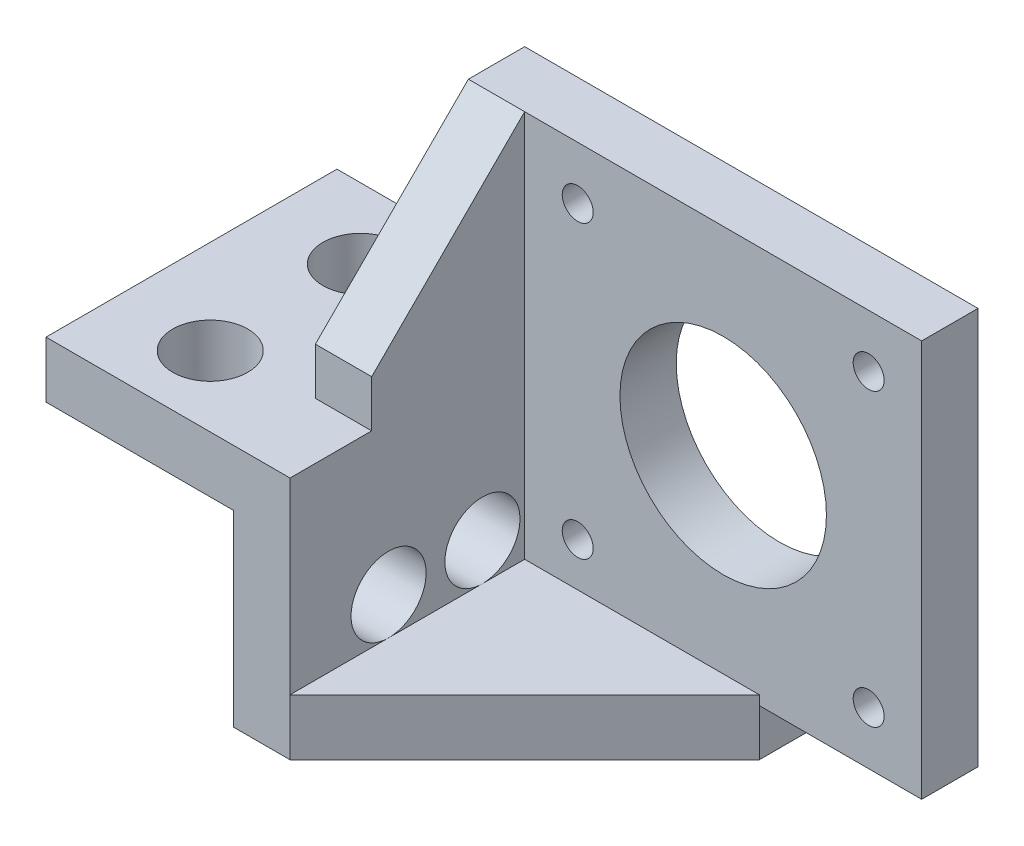
ISO-10303-21;
HEADER;
FILE_DESCRIPTION(('STEP AP214'),'2;1');
FILE_NAME('part.step','',(''),(''),'','','');
FILE_SCHEMA(('AUTOMOTIVE_DESIGN { 1 0 10303 214 1 1 1 1 }'));
ENDSEC;
DATA;
#1=APPLICATION_CONTEXT('core data for automotive mechanical design processes');
#2=APPLICATION_PROTOCOL_DEFINITION('international standard','automotive_design',2000,#1);
#3=PRODUCT_CONTEXT('',#1,'mechanical');
#4=PRODUCT('Part','Part','',(#3));
#5=PRODUCT_RELATED_PRODUCT_CATEGORY('part','',(#4));
#6=PRODUCT_DEFINITION_FORMATION('','',#4);
#7=PRODUCT_DEFINITION_CONTEXT('part definition',#1,'design');
#8=PRODUCT_DEFINITION('design','',#6,#7);
#9=PRODUCT_DEFINITION_SHAPE('','',#8);
#10=(LENGTH_UNIT() NAMED_UNIT(*) SI_UNIT(.MILLI.,.METRE.));
#11=(NAMED_UNIT(*) PLANE_ANGLE_UNIT() SI_UNIT($,.RADIAN.));
#12=(NAMED_UNIT(*) SI_UNIT($,.STERADIAN.) SOLID_ANGLE_UNIT());
#13=UNCERTAINTY_MEASURE_WITH_UNIT(LENGTH_MEASURE(1.E-05),#10,'distance_accuracy_value','');
#14=(GEOMETRIC_REPRESENTATION_CONTEXT(3) GLOBAL_UNCERTAINTY_ASSIGNED_CONTEXT((#13)) GLOBAL_UNIT_ASSIGNED_CONTEXT((#10,
#11,#12)) REPRESENTATION_CONTEXT('',''));
#15=CARTESIAN_POINT('',(0.,0.,0.));
#16=DIRECTION('',(0.,0.,1.));
#17=DIRECTION('',(1.,0.,0.));
#18=AXIS2_PLACEMENT_3D('',#15,#16,#17);
#19=CARTESIAN_POINT('',(0.,0.,6.));
#20=DIRECTION('',(0.,0.,-1.));
#21=DIRECTION('',(-1.,0.,0.));
#22=AXIS2_PLACEMENT_3D('',#19,#20,#21);
#23=PLANE('',#22);
#24=CARTESIAN_POINT('',(47.15,26.15,6.));
#25=DIRECTION('',(0.,0.,-1.));
#26=DIRECTION('',(-1.,0.,0.));
#27=AXIS2_PLACEMENT_3D('',#24,#25,#26);
#28=CIRCLE('',#27,11.);
#29=CARTESIAN_POINT('',(36.15,26.15,6.));
#30=VERTEX_POINT('',#29);
#31=EDGE_CURVE('E291',#30,#30,#28,.T.);
#32=ORIENTED_EDGE('',*,*,#31,.T.);
#33=EDGE_LOOP('',(#32));
#34=FACE_BOUND('',#33,.T.);
#35=CARTESIAN_POINT('',(31.65,10.65,6.));
#36=DIRECTION('',(0.,0.,-1.));
#37=DIRECTION('',(-1.,0.,0.));
#38=AXIS2_PLACEMENT_3D('',#35,#36,#37);
#39=CIRCLE('',#38,1.65);
#40=CARTESIAN_POINT('',(30.,10.65,6.));
#41=VERTEX_POINT('',#40);
#42=EDGE_CURVE('E287',#41,#41,#39,.T.);
#43=ORIENTED_EDGE('',*,*,#42,.T.);
#44=EDGE_LOOP('',(#43));
#45=FACE_BOUND('',#44,.T.);
#46=CARTESIAN_POINT('',(62.65,10.65,6.));
#47=DIRECTION('',(0.,0.,-1.));
#48=DIRECTION('',(-1.,0.,0.));
#49=AXIS2_PLACEMENT_3D('',#46,#47,#48);
#50=CIRCLE('',#49,1.65);
#51=CARTESIAN_POINT('',(61.,10.65,6.));
#52=VERTEX_POINT('',#51);
#53=EDGE_CURVE('E283',#52,#52,#50,.T.);
#54=ORIENTED_EDGE('',*,*,#53,.T.);
#55=EDGE_LOOP('',(#54));
#56=FACE_BOUND('',#55,.T.);
#57=CARTESIAN_POINT('',(62.65,41.65,6.));
#58=DIRECTION('',(0.,0.,-1.));
#59=DIRECTION('',(-1.,0.,0.));
#60=AXIS2_PLACEMENT_3D('',#57,#58,#59);
#61=CIRCLE('',#60,1.65);
#62=CARTESIAN_POINT('',(61.,41.65,6.));
#63=VERTEX_POINT('',#62);
#64=EDGE_CURVE('E278',#63,#63,#61,.T.);
#65=ORIENTED_EDGE('',*,*,#64,.T.);
#66=EDGE_LOOP('',(#65));
#67=FACE_BOUND('',#66,.T.);
#68=CARTESIAN_POINT('',(31.65,41.65,6.));
#69=DIRECTION('',(0.,0.,-1.));
#70=DIRECTION('',(-1.,0.,0.));
#71=AXIS2_PLACEMENT_3D('',#68,#69,#70);
#72=CIRCLE('',#71,1.65);
#73=CARTESIAN_POINT('',(30.,41.65,6.));
#74=VERTEX_POINT('',#73);
#75=EDGE_CURVE('E274',#74,#74,#72,.T.);
#76=ORIENTED_EDGE('',*,*,#75,.T.);
#77=EDGE_LOOP('',(#76));
#78=FACE_BOUND('',#77,.T.);
#79=DIRECTION('',(0.,-1.,0.));
#80=VECTOR('',#79,1.);
#81=CARTESIAN_POINT('',(51.0000000000003,6.,6.));
#82=LINE('',#81,#80);
#83=CARTESIAN_POINT('',(51.0000000000003,6.,6.));
#84=VERTEX_POINT('',#83);
#85=CARTESIAN_POINT('',(51.0000000000003,5.,6.));
#86=VERTEX_POINT('',#85);
#87=EDGE_CURVE('E179',#84,#86,#82,.T.);
#88=ORIENTED_EDGE('',*,*,#87,.T.);
#89=DIRECTION('',(1.,0.,0.));
#90=VECTOR('',#89,1.);
#91=CARTESIAN_POINT('',(0.,5.,6.));
#92=LINE('',#91,#90);
#93=CARTESIAN_POINT('',(68.3,5.,6.));
#94=VERTEX_POINT('',#93);
#95=EDGE_CURVE('E160',#86,#94,#92,.T.);
#96=ORIENTED_EDGE('',*,*,#95,.T.);
#97=DIRECTION('',(0.,1.,0.));
#98=VECTOR('',#97,1.);
#99=CARTESIAN_POINT('',(68.3,0.,6.));
#100=LINE('',#99,#98);
#101=CARTESIAN_POINT('',(68.3,47.3,6.));
#102=VERTEX_POINT('',#101);
#103=EDGE_CURVE('E171',#94,#102,#100,.T.);
#104=ORIENTED_EDGE('',*,*,#103,.T.);
#105=DIRECTION('',(1.,0.,0.));
#106=VECTOR('',#105,1.);
#107=CARTESIAN_POINT('',(0.,47.3,6.));
#108=LINE('',#107,#106);
#109=CARTESIAN_POINT('',(26.,47.3,6.));
#110=VERTEX_POINT('',#109);
#111=EDGE_CURVE('E170',#110,#102,#108,.T.);
#112=ORIENTED_EDGE('',*,*,#111,.F.);
#113=DIRECTION('',(0.,-1.,0.));
#114=VECTOR('',#113,1.);
#115=CARTESIAN_POINT('',(26.,0.,6.));
#116=LINE('',#115,#114);
#117=CARTESIAN_POINT('',(26.,6.,6.));
#118=VERTEX_POINT('',#117);
#119=EDGE_CURVE('E11',#110,#118,#116,.T.);
#120=ORIENTED_EDGE('',*,*,#119,.T.);
#121=DIRECTION('',(-1.,0.,0.));
#122=VECTOR('',#121,1.);
#123=CARTESIAN_POINT('',(26.,6.,6.));
#124=LINE('',#123,#122);
#125=EDGE_CURVE('E71',#84,#118,#124,.T.);
#126=ORIENTED_EDGE('',*,*,#125,.F.);
#127=EDGE_LOOP('',(#88,#96,#104,#112,#120,#126));
#128=FACE_BOUND('',#127,.T.);
#129=ADVANCED_FACE('F47',(#34,#45,#56,#67,#78,#128),#23,.F.);
#130=CARTESIAN_POINT('',(26.,0.,31.));
#131=DIRECTION('',(-1.,0.,0.));
#132=DIRECTION('',(0.,0.,1.));
#133=AXIS2_PLACEMENT_3D('',#130,#131,#132);
#134=PLANE('',#133);
#135=DIRECTION('',(0.,1.,0.));
#136=VECTOR('',#135,1.);
#137=CARTESIAN_POINT('',(26.,0.,31.));
#138=LINE('',#137,#136);
#139=CARTESIAN_POINT('',(26.,6.,31.));
#140=VERTEX_POINT('',#139);
#141=CARTESIAN_POINT('',(26.,26.,31.));
#142=VERTEX_POINT('',#141);
#143=EDGE_CURVE('E354',#140,#142,#138,.T.);
#144=ORIENTED_EDGE('',*,*,#143,.F.);
#145=DIRECTION('',(0.,0.,1.));
#146=VECTOR('',#145,1.);
#147=CARTESIAN_POINT('',(26.,6.,31.));
#148=LINE('',#147,#146);
#149=CARTESIAN_POINT('',(26.,6.,20.5));
#150=VERTEX_POINT('',#149);
#151=EDGE_CURVE('E440',#150,#140,#148,.T.);
#152=ORIENTED_EDGE('',*,*,#151,.F.);
#153=CARTESIAN_POINT('',(26.,10.,20.5));
#154=DIRECTION('',(-1.,0.,0.));
#155=DIRECTION('',(0.,0.,1.));
#156=AXIS2_PLACEMENT_3D('',#153,#154,#155);
#157=CIRCLE('',#156,4.);
#158=EDGE_CURVE('E253',#150,#150,#157,.T.);
#159=ORIENTED_EDGE('',*,*,#158,.T.);
#160=CARTESIAN_POINT('',(26.,6.,10.5));
#161=VERTEX_POINT('',#160);
#162=EDGE_CURVE('E443',#161,#150,#148,.T.);
#163=ORIENTED_EDGE('',*,*,#162,.F.);
#164=CARTESIAN_POINT('',(26.,10.,10.5));
#165=DIRECTION('',(-1.,0.,0.));
#166=DIRECTION('',(0.,0.,1.));
#167=AXIS2_PLACEMENT_3D('',#164,#165,#166);
#168=CIRCLE('',#167,4.);
#169=EDGE_CURVE('E246',#161,#161,#168,.T.);
#170=ORIENTED_EDGE('',*,*,#169,.T.);
#171=EDGE_CURVE('E197',#118,#161,#148,.T.);
#172=ORIENTED_EDGE('',*,*,#171,.F.);
#173=ORIENTED_EDGE('',*,*,#119,.F.);
#174=DIRECTION('',(0.,0.707106781186546,-0.707106781186549));
#175=VECTOR('',#174,1.);
#176=CARTESIAN_POINT('',(26.,26.6500000000001,26.65));
#177=LINE('',#176,#175);
#178=CARTESIAN_POINT('',(26.,31.,22.3000000000001));
#179=VERTEX_POINT('',#178);
#180=EDGE_CURVE('E212',#179,#110,#177,.T.);
#181=ORIENTED_EDGE('',*,*,#180,.F.);
#182=DIRECTION('',(0.,1.,0.));
#183=VECTOR('',#182,1.);
#184=CARTESIAN_POINT('',(26.,0.,22.3000000000001));
#185=LINE('',#184,#183);
#186=CARTESIAN_POINT('',(26.,26.,22.3000000000001));
#187=VERTEX_POINT('',#186);
#188=EDGE_CURVE('E207',#187,#179,#185,.T.);
#189=ORIENTED_EDGE('',*,*,#188,.F.);
#190=DIRECTION('',(0.,0.,-1.));
#191=VECTOR('',#190,1.);
#192=CARTESIAN_POINT('',(26.,26.,31.));
#193=LINE('',#192,#191);
#194=EDGE_CURVE('E357',#142,#187,#193,.T.);
#195=ORIENTED_EDGE('',*,*,#194,.F.);
#196=EDGE_LOOP('',(#144,#152,#159,#163,#170,#172,#173,#181,#189,#195));
#197=FACE_BOUND('',#196,.T.);
#198=ADVANCED_FACE('F414',(#197),#134,.F.);
#199=CARTESIAN_POINT('',(0.,26.,31.));
#200=DIRECTION('',(0.,1.,0.));
#201=DIRECTION('',(-1.,0.,0.));
#202=AXIS2_PLACEMENT_3D('',#199,#200,#201);
#203=PLANE('',#202);
#204=CARTESIAN_POINT('',(10.,26.,7.5));
#205=DIRECTION('',(0.,1.,0.));
#206=DIRECTION('',(-1.,0.,0.));
#207=AXIS2_PLACEMENT_3D('',#204,#205,#206);
#208=CIRCLE('',#207,4.);
#209=CARTESIAN_POINT('',(6.,26.,7.5));
#210=VERTEX_POINT('',#209);
#211=EDGE_CURVE('E262',#210,#210,#208,.F.);
#212=ORIENTED_EDGE('',*,*,#211,.T.);
#213=EDGE_LOOP('',(#212));
#214=FACE_BOUND('',#213,.T.);
#215=CARTESIAN_POINT('',(10.,26.,23.5));
#216=DIRECTION('',(0.,1.,0.));
#217=DIRECTION('',(-1.,0.,0.));
#218=AXIS2_PLACEMENT_3D('',#215,#216,#217);
#219=CIRCLE('',#218,4.);
#220=CARTESIAN_POINT('',(6.,26.,23.5));
#221=VERTEX_POINT('',#220);
#222=EDGE_CURVE('E257',#221,#221,#219,.F.);
#223=ORIENTED_EDGE('',*,*,#222,.T.);
#224=EDGE_LOOP('',(#223));
#225=FACE_BOUND('',#224,.T.);
#226=ORIENTED_EDGE('',*,*,#194,.T.);
#227=DIRECTION('',(1.,0.,0.));
#228=VECTOR('',#227,1.);
#229=CARTESIAN_POINT('',(20.,26.,22.3000000000001));
#230=LINE('',#229,#228);
#231=CARTESIAN_POINT('',(20.,26.,22.3000000000001));
#232=VERTEX_POINT('',#231);
#233=EDGE_CURVE('E238',#232,#187,#230,.T.);
#234=ORIENTED_EDGE('',*,*,#233,.F.);
#235=DIRECTION('',(0.,0.,1.));
#236=VECTOR('',#235,1.);
#237=CARTESIAN_POINT('',(20.,26.,0.));
#238=LINE('',#237,#236);
#239=CARTESIAN_POINT('',(20.,26.,0.));
#240=VERTEX_POINT('',#239);
#241=EDGE_CURVE('E211',#240,#232,#238,.T.);
#242=ORIENTED_EDGE('',*,*,#241,.F.);
#243=DIRECTION('',(1.,0.,0.));
#244=VECTOR('',#243,1.);
#245=CARTESIAN_POINT('',(0.,26.,0.));
#246=LINE('',#245,#244);
#247=CARTESIAN_POINT('',(0.,26.,0.));
#248=VERTEX_POINT('',#247);
#249=EDGE_CURVE('E332',#248,#240,#246,.T.);
#250=ORIENTED_EDGE('',*,*,#249,.F.);
#251=DIRECTION('',(0.,0.,-1.));
#252=VECTOR('',#251,1.);
#253=CARTESIAN_POINT('',(0.,26.,31.));
#254=LINE('',#253,#252);
#255=CARTESIAN_POINT('',(0.,26.,31.));
#256=VERTEX_POINT('',#255);
#257=EDGE_CURVE('E51',#256,#248,#254,.T.);
#258=ORIENTED_EDGE('',*,*,#257,.F.);
#259=DIRECTION('',(1.,0.,0.));
#260=VECTOR('',#259,1.);
#261=CARTESIAN_POINT('',(0.,26.,31.));
#262=LINE('',#261,#260);
#263=EDGE_CURVE('E335',#256,#142,#262,.T.);
#264=ORIENTED_EDGE('',*,*,#263,.T.);
#265=EDGE_LOOP('',(#226,#234,#242,#250,#258,#264));
#266=FACE_BOUND('',#265,.T.);
#267=ADVANCED_FACE('F49',(#214,#225,#266),#203,.T.);
#268=CARTESIAN_POINT('',(0.,0.,31.));
#269=DIRECTION('',(-1.,0.,0.));
#270=DIRECTION('',(0.,0.,1.));
#271=AXIS2_PLACEMENT_3D('',#268,#269,#270);
#272=PLANE('',#271);
#273=DIRECTION('',(0.,1.,0.));
#274=VECTOR('',#273,1.);
#275=CARTESIAN_POINT('',(0.,0.,0.));
#276=LINE('',#275,#274);
#277=CARTESIAN_POINT('',(0.,20.,0.));
#278=VERTEX_POINT('',#277);
#279=EDGE_CURVE('E361',#278,#248,#276,.T.);
#280=ORIENTED_EDGE('',*,*,#279,.F.);
#281=DIRECTION('',(0.,0.,-1.));
#282=VECTOR('',#281,1.);
#283=CARTESIAN_POINT('',(0.,20.,31.));
#284=LINE('',#283,#282);
#285=CARTESIAN_POINT('',(0.,20.,31.));
#286=VERTEX_POINT('',#285);
#287=EDGE_CURVE('E383',#286,#278,#284,.T.);
#288=ORIENTED_EDGE('',*,*,#287,.F.);
#289=DIRECTION('',(0.,1.,0.));
#290=VECTOR('',#289,1.);
#291=CARTESIAN_POINT('',(0.,0.,31.));
#292=LINE('',#291,#290);
#293=EDGE_CURVE('E339',#286,#256,#292,.T.);
#294=ORIENTED_EDGE('',*,*,#293,.T.);
#295=ORIENTED_EDGE('',*,*,#257,.T.);
#296=EDGE_LOOP('',(#280,#288,#294,#295));
#297=FACE_BOUND('',#296,.T.);
#298=ADVANCED_FACE('F392',(#297),#272,.T.);
#299=CARTESIAN_POINT('',(0.,20.,31.));
#300=DIRECTION('',(0.,1.,0.));
#301=DIRECTION('',(-1.,0.,0.));
#302=AXIS2_PLACEMENT_3D('',#299,#300,#301);
#303=PLANE('',#302);
#304=CARTESIAN_POINT('',(10.,20.,7.5));
#305=DIRECTION('',(0.,-1.,0.));
#306=DIRECTION('',(1.,0.,0.));
#307=AXIS2_PLACEMENT_3D('',#304,#305,#306);
#308=CIRCLE('',#307,4.);
#309=CARTESIAN_POINT('',(14.,20.,7.5));
#310=VERTEX_POINT('',#309);
#311=EDGE_CURVE('E258',#310,#310,#308,.T.);
#312=ORIENTED_EDGE('',*,*,#311,.F.);
#313=EDGE_LOOP('',(#312));
#314=FACE_BOUND('',#313,.T.);
#315=CARTESIAN_POINT('',(10.,20.,23.5));
#316=DIRECTION('',(0.,-1.,0.));
#317=DIRECTION('',(1.,0.,0.));
#318=AXIS2_PLACEMENT_3D('',#315,#316,#317);
#319=CIRCLE('',#318,4.);
#320=CARTESIAN_POINT('',(14.,20.,23.5));
#321=VERTEX_POINT('',#320);
#322=EDGE_CURVE('E263',#321,#321,#319,.T.);
#323=ORIENTED_EDGE('',*,*,#322,.F.);
#324=EDGE_LOOP('',(#323));
#325=FACE_BOUND('',#324,.T.);
#326=DIRECTION('',(1.,0.,0.));
#327=VECTOR('',#326,1.);
#328=CARTESIAN_POINT('',(0.,20.,0.));
#329=LINE('',#328,#327);
#330=CARTESIAN_POINT('',(20.,20.,0.));
#331=VERTEX_POINT('',#330);
#332=EDGE_CURVE('E365',#278,#331,#329,.T.);
#333=ORIENTED_EDGE('',*,*,#332,.T.);
#334=DIRECTION('',(0.,0.,-1.));
#335=VECTOR('',#334,1.);
#336=CARTESIAN_POINT('',(20.,20.,31.));
#337=LINE('',#336,#335);
#338=CARTESIAN_POINT('',(20.,20.,31.));
#339=VERTEX_POINT('',#338);
#340=EDGE_CURVE('E381',#339,#331,#337,.T.);
#341=ORIENTED_EDGE('',*,*,#340,.F.);
#342=DIRECTION('',(1.,0.,0.));
#343=VECTOR('',#342,1.);
#344=CARTESIAN_POINT('',(0.,20.,31.));
#345=LINE('',#344,#343);
#346=EDGE_CURVE('E344',#286,#339,#345,.T.);
#347=ORIENTED_EDGE('',*,*,#346,.F.);
#348=ORIENTED_EDGE('',*,*,#287,.T.);
#349=EDGE_LOOP('',(#333,#341,#347,#348));
#350=FACE_BOUND('',#349,.T.);
#351=ADVANCED_FACE('F405',(#314,#325,#350),#303,.F.);
#352=CARTESIAN_POINT('',(20.,0.,31.));
#353=DIRECTION('',(-1.,0.,0.));
#354=DIRECTION('',(0.,0.,1.));
#355=AXIS2_PLACEMENT_3D('',#352,#353,#354);
#356=PLANE('',#355);
#357=CARTESIAN_POINT('',(20.,10.,20.5));
#358=DIRECTION('',(-1.,0.,0.));
#359=DIRECTION('',(0.,0.,1.));
#360=AXIS2_PLACEMENT_3D('',#357,#358,#359);
#361=CIRCLE('',#360,4.);
#362=CARTESIAN_POINT('',(20.,10.,24.5));
#363=VERTEX_POINT('',#362);
#364=EDGE_CURVE('E242',#363,#363,#361,.T.);
#365=ORIENTED_EDGE('',*,*,#364,.F.);
#366=EDGE_LOOP('',(#365));
#367=FACE_BOUND('',#366,.T.);
#368=CARTESIAN_POINT('',(20.,10.,10.5));
#369=DIRECTION('',(-1.,0.,0.));
#370=DIRECTION('',(0.,0.,1.));
#371=AXIS2_PLACEMENT_3D('',#368,#369,#370);
#372=CIRCLE('',#371,4.);
#373=CARTESIAN_POINT('',(20.,10.,14.5));
#374=VERTEX_POINT('',#373);
#375=EDGE_CURVE('E241',#374,#374,#372,.T.);
#376=ORIENTED_EDGE('',*,*,#375,.F.);
#377=EDGE_LOOP('',(#376));
#378=FACE_BOUND('',#377,.T.);
#379=DIRECTION('',(0.,1.,0.));
#380=VECTOR('',#379,1.);
#381=CARTESIAN_POINT('',(20.,0.,0.));
#382=LINE('',#381,#380);
#383=CARTESIAN_POINT('',(20.,0.,0.));
#384=VERTEX_POINT('',#383);
#385=EDGE_CURVE('E369',#384,#331,#382,.T.);
#386=ORIENTED_EDGE('',*,*,#385,.F.);
#387=DIRECTION('',(0.,0.,-1.));
#388=VECTOR('',#387,1.);
#389=CARTESIAN_POINT('',(20.,0.,31.));
#390=LINE('',#389,#388);
#391=CARTESIAN_POINT('',(20.,0.,31.));
#392=VERTEX_POINT('',#391);
#393=EDGE_CURVE('E378',#392,#384,#390,.T.);
#394=ORIENTED_EDGE('',*,*,#393,.F.);
#395=DIRECTION('',(0.,1.,0.));
#396=VECTOR('',#395,1.);
#397=CARTESIAN_POINT('',(20.,0.,31.));
#398=LINE('',#397,#396);
#399=EDGE_CURVE('E347',#392,#339,#398,.T.);
#400=ORIENTED_EDGE('',*,*,#399,.T.);
#401=ORIENTED_EDGE('',*,*,#340,.T.);
#402=EDGE_LOOP('',(#386,#394,#400,#401));
#403=FACE_BOUND('',#402,.T.);
#404=ADVANCED_FACE('F408',(#367,#378,#403),#356,.T.);
#405=CARTESIAN_POINT('',(0.,0.,31.));
#406=DIRECTION('',(0.,1.,0.));
#407=DIRECTION('',(-1.,0.,0.));
#408=AXIS2_PLACEMENT_3D('',#405,#406,#407);
#409=PLANE('',#408);
#410=DIRECTION('',(1.,0.,0.));
#411=VECTOR('',#410,1.);
#412=CARTESIAN_POINT('',(0.,0.,0.));
#413=LINE('',#412,#411);
#414=CARTESIAN_POINT('',(51.0000000000003,0.,0.));
#415=VERTEX_POINT('',#414);
#416=EDGE_CURVE('E340',#384,#415,#413,.T.);
#417=ORIENTED_EDGE('',*,*,#416,.T.);
#418=DIRECTION('',(0.,0.,-1.));
#419=VECTOR('',#418,1.);
#420=CARTESIAN_POINT('',(51.0000000000003,0.,0.));
#421=LINE('',#420,#419);
#422=CARTESIAN_POINT('',(51.0000000000003,0.,6.));
#423=VERTEX_POINT('',#422);
#424=EDGE_CURVE('E187',#423,#415,#421,.T.);
#425=ORIENTED_EDGE('',*,*,#424,.F.);
#426=DIRECTION('',(0.707106781186552,0.,-0.707106781186543));
#427=VECTOR('',#426,1.);
#428=CARTESIAN_POINT('',(28.4999999999998,0.,28.5000000000002));
#429=LINE('',#428,#427);
#430=CARTESIAN_POINT('',(26.,0.,31.));
#431=VERTEX_POINT('',#430);
#432=EDGE_CURVE('E181',#431,#423,#429,.T.);
#433=ORIENTED_EDGE('',*,*,#432,.F.);
#434=DIRECTION('',(1.,0.,0.));
#435=VECTOR('',#434,1.);
#436=CARTESIAN_POINT('',(0.,0.,31.));
#437=LINE('',#436,#435);
#438=EDGE_CURVE('E351',#392,#431,#437,.T.);
#439=ORIENTED_EDGE('',*,*,#438,.F.);
#440=ORIENTED_EDGE('',*,*,#393,.T.);
#441=EDGE_LOOP('',(#417,#425,#433,#439,#440));
#442=FACE_BOUND('',#441,.T.);
#443=ADVANCED_FACE('F504',(#442),#409,.F.);
#444=CARTESIAN_POINT('',(0.,0.,31.));
#445=DIRECTION('',(0.,0.,1.));
#446=DIRECTION('',(1.,0.,0.));
#447=AXIS2_PLACEMENT_3D('',#444,#445,#446);
#448=PLANE('',#447);
#449=ORIENTED_EDGE('',*,*,#263,.F.);
#450=ORIENTED_EDGE('',*,*,#293,.F.);
#451=ORIENTED_EDGE('',*,*,#346,.T.);
#452=ORIENTED_EDGE('',*,*,#399,.F.);
#453=ORIENTED_EDGE('',*,*,#438,.T.);
#454=EDGE_CURVE('E64',#431,#140,#138,.T.);
#455=ORIENTED_EDGE('',*,*,#454,.T.);
#456=ORIENTED_EDGE('',*,*,#143,.T.);
#457=EDGE_LOOP('',(#449,#450,#451,#452,#453,#455,#456));
#458=FACE_BOUND('',#457,.T.);
#459=ADVANCED_FACE('F410',(#458),#448,.T.);
#460=CARTESIAN_POINT('',(0.,0.,0.));
#461=DIRECTION('',(0.,0.,1.));
#462=DIRECTION('',(1.,0.,0.));
#463=AXIS2_PLACEMENT_3D('',#460,#461,#462);
#464=PLANE('',#463);
#465=ORIENTED_EDGE('',*,*,#249,.T.);
#466=DIRECTION('',(0.,-1.,0.));
#467=VECTOR('',#466,1.);
#468=CARTESIAN_POINT('',(20.,0.,0.));
#469=LINE('',#468,#467);
#470=CARTESIAN_POINT('',(20.,47.3,0.));
#471=VERTEX_POINT('',#470);
#472=EDGE_CURVE('E208',#471,#240,#469,.T.);
#473=ORIENTED_EDGE('',*,*,#472,.F.);
#474=DIRECTION('',(1.,0.,0.));
#475=VECTOR('',#474,1.);
#476=CARTESIAN_POINT('',(0.,47.3,0.));
#477=LINE('',#476,#475);
#478=CARTESIAN_POINT('',(68.3,47.3,0.));
#479=VERTEX_POINT('',#478);
#480=EDGE_CURVE('E279',#471,#479,#477,.T.);
#481=ORIENTED_EDGE('',*,*,#480,.T.);
#482=DIRECTION('',(0.,1.,0.));
#483=VECTOR('',#482,1.);
#484=CARTESIAN_POINT('',(68.3,0.,0.));
#485=LINE('',#484,#483);
#486=CARTESIAN_POINT('',(68.3,5.,0.));
#487=VERTEX_POINT('',#486);
#488=EDGE_CURVE('E319',#487,#479,#485,.T.);
#489=ORIENTED_EDGE('',*,*,#488,.F.);
#490=DIRECTION('',(1.,0.,0.));
#491=VECTOR('',#490,1.);
#492=CARTESIAN_POINT('',(0.,5.,0.));
#493=LINE('',#492,#491);
#494=CARTESIAN_POINT('',(51.0000000000003,5.,0.));
#495=VERTEX_POINT('',#494);
#496=EDGE_CURVE('E323',#495,#487,#493,.T.);
#497=ORIENTED_EDGE('',*,*,#496,.F.);
#498=DIRECTION('',(0.,1.,0.));
#499=VECTOR('',#498,1.);
#500=CARTESIAN_POINT('',(51.0000000000003,0.,0.));
#501=LINE('',#500,#499);
#502=EDGE_CURVE('E186',#415,#495,#501,.T.);
#503=ORIENTED_EDGE('',*,*,#502,.F.);
#504=ORIENTED_EDGE('',*,*,#416,.F.);
#505=ORIENTED_EDGE('',*,*,#385,.T.);
#506=ORIENTED_EDGE('',*,*,#332,.F.);
#507=ORIENTED_EDGE('',*,*,#279,.T.);
#508=EDGE_LOOP('',(#465,#473,#481,#489,#497,#503,#504,#505,#506,#507));
#509=FACE_BOUND('',#508,.T.);
#510=CARTESIAN_POINT('',(31.65,41.65,0.));
#511=DIRECTION('',(0.,0.,-1.));
#512=DIRECTION('',(-1.,0.,0.));
#513=AXIS2_PLACEMENT_3D('',#510,#511,#512);
#514=CIRCLE('',#513,1.65);
#515=CARTESIAN_POINT('',(30.,41.65,0.));
#516=VERTEX_POINT('',#515);
#517=EDGE_CURVE('E267',#516,#516,#514,.T.);
#518=ORIENTED_EDGE('',*,*,#517,.F.);
#519=EDGE_LOOP('',(#518));
#520=FACE_BOUND('',#519,.T.);
#521=CARTESIAN_POINT('',(62.65,41.65,0.));
#522=DIRECTION('',(0.,0.,-1.));
#523=DIRECTION('',(-1.,0.,0.));
#524=AXIS2_PLACEMENT_3D('',#521,#522,#523);
#525=CIRCLE('',#524,1.65);
#526=CARTESIAN_POINT('',(61.,41.65,0.));
#527=VERTEX_POINT('',#526);
#528=EDGE_CURVE('E303',#527,#527,#525,.T.);
#529=ORIENTED_EDGE('',*,*,#528,.F.);
#530=EDGE_LOOP('',(#529));
#531=FACE_BOUND('',#530,.T.);
#532=CARTESIAN_POINT('',(62.65,10.65,0.));
#533=DIRECTION('',(0.,0.,-1.));
#534=DIRECTION('',(-1.,0.,0.));
#535=AXIS2_PLACEMENT_3D('',#532,#533,#534);
#536=CIRCLE('',#535,1.65);
#537=CARTESIAN_POINT('',(61.,10.65,0.));
#538=VERTEX_POINT('',#537);
#539=EDGE_CURVE('E307',#538,#538,#536,.T.);
#540=ORIENTED_EDGE('',*,*,#539,.F.);
#541=EDGE_LOOP('',(#540));
#542=FACE_BOUND('',#541,.T.);
#543=CARTESIAN_POINT('',(31.65,10.65,0.));
#544=DIRECTION('',(0.,0.,-1.));
#545=DIRECTION('',(-1.,0.,0.));
#546=AXIS2_PLACEMENT_3D('',#543,#544,#545);
#547=CIRCLE('',#546,1.65);
#548=CARTESIAN_POINT('',(30.,10.65,0.));
#549=VERTEX_POINT('',#548);
#550=EDGE_CURVE('E311',#549,#549,#547,.T.);
#551=ORIENTED_EDGE('',*,*,#550,.F.);
#552=EDGE_LOOP('',(#551));
#553=FACE_BOUND('',#552,.T.);
#554=CARTESIAN_POINT('',(47.15,26.15,0.));
#555=DIRECTION('',(0.,0.,-1.));
#556=DIRECTION('',(-1.,0.,0.));
#557=AXIS2_PLACEMENT_3D('',#554,#555,#556);
#558=CIRCLE('',#557,11.);
#559=CARTESIAN_POINT('',(36.15,26.15,0.));
#560=VERTEX_POINT('',#559);
#561=EDGE_CURVE('E315',#560,#560,#558,.T.);
#562=ORIENTED_EDGE('',*,*,#561,.F.);
#563=EDGE_LOOP('',(#562));
#564=FACE_BOUND('',#563,.T.);
#565=ADVANCED_FACE('F400',(#509,#520,#531,#542,#553,#564),#464,.F.);
#566=CARTESIAN_POINT('',(68.3,0.,6.));
#567=DIRECTION('',(-1.,0.,0.));
#568=DIRECTION('',(0.,0.,1.));
#569=AXIS2_PLACEMENT_3D('',#566,#567,#568);
#570=PLANE('',#569);
#571=ORIENTED_EDGE('',*,*,#488,.T.);
#572=DIRECTION('',(0.,0.,-1.));
#573=VECTOR('',#572,1.);
#574=CARTESIAN_POINT('',(68.3,47.3,6.));
#575=LINE('',#574,#573);
#576=EDGE_CURVE('E329',#102,#479,#575,.T.);
#577=ORIENTED_EDGE('',*,*,#576,.F.);
#578=ORIENTED_EDGE('',*,*,#103,.F.);
#579=DIRECTION('',(0.,0.,-1.));
#580=VECTOR('',#579,1.);
#581=CARTESIAN_POINT('',(68.3,5.,6.));
#582=LINE('',#581,#580);
#583=EDGE_CURVE('E167',#94,#487,#582,.T.);
#584=ORIENTED_EDGE('',*,*,#583,.T.);
#585=EDGE_LOOP('',(#571,#577,#578,#584));
#586=FACE_BOUND('',#585,.T.);
#587=ADVANCED_FACE('F434',(#586),#570,.F.);
#588=CARTESIAN_POINT('',(0.,47.3,6.));
#589=DIRECTION('',(0.,1.,0.));
#590=DIRECTION('',(0.,0.,1.));
#591=AXIS2_PLACEMENT_3D('',#588,#589,#590);
#592=PLANE('',#591);
#593=ORIENTED_EDGE('',*,*,#480,.F.);
#594=DIRECTION('',(0.,0.,-1.));
#595=VECTOR('',#594,1.);
#596=CARTESIAN_POINT('',(20.,47.3,0.));
#597=LINE('',#596,#595);
#598=CARTESIAN_POINT('',(20.,47.3,6.));
#599=VERTEX_POINT('',#598);
#600=EDGE_CURVE('E221',#599,#471,#597,.T.);
#601=ORIENTED_EDGE('',*,*,#600,.F.);
#602=DIRECTION('',(1.,0.,0.));
#603=VECTOR('',#602,1.);
#604=CARTESIAN_POINT('',(20.,47.3,6.));
#605=LINE('',#604,#603);
#606=EDGE_CURVE('E225',#599,#110,#605,.T.);
#607=ORIENTED_EDGE('',*,*,#606,.T.);
#608=ORIENTED_EDGE('',*,*,#111,.T.);
#609=ORIENTED_EDGE('',*,*,#576,.T.);
#610=EDGE_LOOP('',(#593,#601,#607,#608,#609));
#611=FACE_BOUND('',#610,.T.);
#612=ADVANCED_FACE('F430',(#611),#592,.T.);
#613=CARTESIAN_POINT('',(47.15,26.15,6.));
#614=DIRECTION('',(0.,0.,-1.));
#615=DIRECTION('',(-1.,0.,0.));
#616=AXIS2_PLACEMENT_3D('',#613,#614,#615);
#617=CYLINDRICAL_SURFACE('',#616,11.);
#618=ORIENTED_EDGE('',*,*,#31,.F.);
#619=EDGE_LOOP('',(#618));
#620=FACE_BOUND('',#619,.T.);
#621=ORIENTED_EDGE('',*,*,#561,.T.);
#622=EDGE_LOOP('',(#621));
#623=FACE_BOUND('',#622,.T.);
#624=ADVANCED_FACE('F478',(#620,#623),#617,.F.);
#625=CARTESIAN_POINT('',(31.65,10.65,6.));
#626=DIRECTION('',(0.,0.,-1.));
#627=DIRECTION('',(-1.,0.,0.));
#628=AXIS2_PLACEMENT_3D('',#625,#626,#627);
#629=CYLINDRICAL_SURFACE('',#628,1.65);
#630=ORIENTED_EDGE('',*,*,#42,.F.);
#631=EDGE_LOOP('',(#630));
#632=FACE_BOUND('',#631,.T.);
#633=ORIENTED_EDGE('',*,*,#550,.T.);
#634=EDGE_LOOP('',(#633));
#635=FACE_BOUND('',#634,.T.);
#636=ADVANCED_FACE('F486',(#632,#635),#629,.F.);
#637=CARTESIAN_POINT('',(62.65,10.65,6.));
#638=DIRECTION('',(0.,0.,-1.));
#639=DIRECTION('',(-1.,0.,0.));
#640=AXIS2_PLACEMENT_3D('',#637,#638,#639);
#641=CYLINDRICAL_SURFACE('',#640,1.65);
#642=ORIENTED_EDGE('',*,*,#53,.F.);
#643=EDGE_LOOP('',(#642));
#644=FACE_BOUND('',#643,.T.);
#645=ORIENTED_EDGE('',*,*,#539,.T.);
#646=EDGE_LOOP('',(#645));
#647=FACE_BOUND('',#646,.T.);
#648=ADVANCED_FACE('F490',(#644,#647),#641,.F.);
#649=CARTESIAN_POINT('',(62.65,41.65,6.));
#650=DIRECTION('',(0.,0.,-1.));
#651=DIRECTION('',(-1.,0.,0.));
#652=AXIS2_PLACEMENT_3D('',#649,#650,#651);
#653=CYLINDRICAL_SURFACE('',#652,1.65);
#654=ORIENTED_EDGE('',*,*,#64,.F.);
#655=EDGE_LOOP('',(#654));
#656=FACE_BOUND('',#655,.T.);
#657=ORIENTED_EDGE('',*,*,#528,.T.);
#658=EDGE_LOOP('',(#657));
#659=FACE_BOUND('',#658,.T.);
#660=ADVANCED_FACE('F494',(#656,#659),#653,.F.);
#661=CARTESIAN_POINT('',(31.65,41.65,6.));
#662=DIRECTION('',(0.,0.,-1.));
#663=DIRECTION('',(-1.,0.,0.));
#664=AXIS2_PLACEMENT_3D('',#661,#662,#663);
#665=CYLINDRICAL_SURFACE('',#664,1.65);
#666=ORIENTED_EDGE('',*,*,#75,.F.);
#667=EDGE_LOOP('',(#666));
#668=FACE_BOUND('',#667,.T.);
#669=ORIENTED_EDGE('',*,*,#517,.T.);
#670=EDGE_LOOP('',(#669));
#671=FACE_BOUND('',#670,.T.);
#672=ADVANCED_FACE('F481',(#668,#671),#665,.F.);
#673=CARTESIAN_POINT('',(0.,5.,6.));
#674=DIRECTION('',(0.,1.,0.));
#675=DIRECTION('',(-1.,0.,0.));
#676=AXIS2_PLACEMENT_3D('',#673,#674,#675);
#677=PLANE('',#676);
#678=ORIENTED_EDGE('',*,*,#95,.F.);
#679=DIRECTION('',(0.,0.,-1.));
#680=VECTOR('',#679,1.);
#681=CARTESIAN_POINT('',(51.0000000000003,5.,0.));
#682=LINE('',#681,#680);
#683=EDGE_CURVE('E164',#86,#495,#682,.T.);
#684=ORIENTED_EDGE('',*,*,#683,.T.);
#685=ORIENTED_EDGE('',*,*,#496,.T.);
#686=ORIENTED_EDGE('',*,*,#583,.F.);
#687=EDGE_LOOP('',(#678,#684,#685,#686));
#688=FACE_BOUND('',#687,.T.);
#689=ADVANCED_FACE('F162',(#688),#677,.F.);
#690=CARTESIAN_POINT('',(9.99999999999999,37.3137084989848,23.5));
#691=DIRECTION('',(0.,-1.,0.));
#692=DIRECTION('',(1.,0.,0.));
#693=AXIS2_PLACEMENT_3D('',#690,#691,#692);
#694=CYLINDRICAL_SURFACE('',#693,4.);
#695=ORIENTED_EDGE('',*,*,#322,.T.);
#696=EDGE_LOOP('',(#695));
#697=FACE_BOUND('',#696,.T.);
#698=ORIENTED_EDGE('',*,*,#222,.F.);
#699=EDGE_LOOP('',(#698));
#700=FACE_BOUND('',#699,.T.);
#701=ADVANCED_FACE('F474',(#697,#700),#694,.F.);
#702=CARTESIAN_POINT('',(10.,37.3137084989848,7.5));
#703=DIRECTION('',(0.,-1.,0.));
#704=DIRECTION('',(1.,0.,0.));
#705=AXIS2_PLACEMENT_3D('',#702,#703,#704);
#706=CYLINDRICAL_SURFACE('',#705,4.);
#707=ORIENTED_EDGE('',*,*,#311,.T.);
#708=EDGE_LOOP('',(#707));
#709=FACE_BOUND('',#708,.T.);
#710=ORIENTED_EDGE('',*,*,#211,.F.);
#711=EDGE_LOOP('',(#710));
#712=FACE_BOUND('',#711,.T.);
#713=ADVANCED_FACE('F460',(#709,#712),#706,.F.);
#714=CARTESIAN_POINT('',(68.3,10.,10.5));
#715=DIRECTION('',(-1.,0.,0.));
#716=DIRECTION('',(0.,0.,1.));
#717=AXIS2_PLACEMENT_3D('',#714,#715,#716);
#718=CYLINDRICAL_SURFACE('',#717,4.);
#719=ORIENTED_EDGE('',*,*,#375,.T.);
#720=EDGE_LOOP('',(#719));
#721=FACE_BOUND('',#720,.T.);
#722=ORIENTED_EDGE('',*,*,#169,.F.);
#723=EDGE_LOOP('',(#722));
#724=FACE_BOUND('',#723,.T.);
#725=ADVANCED_FACE('F451',(#721,#724),#718,.F.);
#726=CARTESIAN_POINT('',(68.3,10.,20.5));
#727=DIRECTION('',(-1.,0.,0.));
#728=DIRECTION('',(0.,0.,1.));
#729=AXIS2_PLACEMENT_3D('',#726,#727,#728);
#730=CYLINDRICAL_SURFACE('',#729,4.);
#731=ORIENTED_EDGE('',*,*,#364,.T.);
#732=EDGE_LOOP('',(#731));
#733=FACE_BOUND('',#732,.T.);
#734=ORIENTED_EDGE('',*,*,#158,.F.);
#735=EDGE_LOOP('',(#734));
#736=FACE_BOUND('',#735,.T.);
#737=ADVANCED_FACE('F449',(#733,#736),#730,.F.);
#738=CARTESIAN_POINT('',(20.,0.,22.3000000000001));
#739=DIRECTION('',(0.,0.,-1.));
#740=DIRECTION('',(-1.,0.,0.));
#741=AXIS2_PLACEMENT_3D('',#738,#739,#740);
#742=PLANE('',#741);
#743=ORIENTED_EDGE('',*,*,#188,.T.);
#744=DIRECTION('',(1.,0.,0.));
#745=VECTOR('',#744,1.);
#746=CARTESIAN_POINT('',(20.,31.,22.3000000000001));
#747=LINE('',#746,#745);
#748=CARTESIAN_POINT('',(20.,31.,22.3000000000001));
#749=VERTEX_POINT('',#748);
#750=EDGE_CURVE('E234',#749,#179,#747,.T.);
#751=ORIENTED_EDGE('',*,*,#750,.F.);
#752=DIRECTION('',(0.,1.,0.));
#753=VECTOR('',#752,1.);
#754=CARTESIAN_POINT('',(20.,0.,22.3000000000001));
#755=LINE('',#754,#753);
#756=EDGE_CURVE('E215',#232,#749,#755,.T.);
#757=ORIENTED_EDGE('',*,*,#756,.F.);
#758=ORIENTED_EDGE('',*,*,#233,.T.);
#759=EDGE_LOOP('',(#743,#751,#757,#758));
#760=FACE_BOUND('',#759,.T.);
#761=ADVANCED_FACE('F419',(#760),#742,.F.);
#762=CARTESIAN_POINT('',(20.,26.6500000000001,26.65));
#763=DIRECTION('',(0.,-0.707106781186549,-0.707106781186546));
#764=DIRECTION('',(0.,0.707106781186546,-0.707106781186549));
#765=AXIS2_PLACEMENT_3D('',#762,#763,#764);
#766=PLANE('',#765);
#767=ORIENTED_EDGE('',*,*,#180,.T.);
#768=ORIENTED_EDGE('',*,*,#606,.F.);
#769=DIRECTION('',(0.,0.707106781186546,-0.707106781186549));
#770=VECTOR('',#769,1.);
#771=CARTESIAN_POINT('',(20.,26.6500000000001,26.65));
#772=LINE('',#771,#770);
#773=EDGE_CURVE('E218',#749,#599,#772,.T.);
#774=ORIENTED_EDGE('',*,*,#773,.F.);
#775=ORIENTED_EDGE('',*,*,#750,.T.);
#776=EDGE_LOOP('',(#767,#768,#774,#775));
#777=FACE_BOUND('',#776,.T.);
#778=ADVANCED_FACE('F423',(#777),#766,.F.);
#779=CARTESIAN_POINT('',(20.,0.,0.));
#780=DIRECTION('',(-1.,0.,0.));
#781=DIRECTION('',(0.,0.,1.));
#782=AXIS2_PLACEMENT_3D('',#779,#780,#781);
#783=PLANE('',#782);
#784=ORIENTED_EDGE('',*,*,#472,.T.);
#785=ORIENTED_EDGE('',*,*,#241,.T.);
#786=ORIENTED_EDGE('',*,*,#756,.T.);
#787=ORIENTED_EDGE('',*,*,#773,.T.);
#788=ORIENTED_EDGE('',*,*,#600,.T.);
#789=EDGE_LOOP('',(#784,#785,#786,#787,#788));
#790=FACE_BOUND('',#789,.T.);
#791=ADVANCED_FACE('F427',(#790),#783,.T.);
#792=CARTESIAN_POINT('',(28.4999999999998,0.,28.5000000000002));
#793=DIRECTION('',(0.707106781186543,0.,0.707106781186552));
#794=DIRECTION('',(0.707106781186552,0.,-0.707106781186543));
#795=AXIS2_PLACEMENT_3D('',#792,#793,#794);
#796=PLANE('',#795);
#797=DIRECTION('',(0.,1.,0.));
#798=VECTOR('',#797,1.);
#799=CARTESIAN_POINT('',(51.0000000000003,0.,6.));
#800=LINE('',#799,#798);
#801=EDGE_CURVE('E176',#423,#86,#800,.T.);
#802=ORIENTED_EDGE('',*,*,#801,.T.);
#803=ORIENTED_EDGE('',*,*,#87,.F.);
#804=DIRECTION('',(0.707106781186551,0.,-0.707106781186543));
#805=VECTOR('',#804,1.);
#806=CARTESIAN_POINT('',(51.0000000000003,6.,6.));
#807=LINE('',#806,#805);
#808=EDGE_CURVE('E194',#140,#84,#807,.T.);
#809=ORIENTED_EDGE('',*,*,#808,.F.);
#810=ORIENTED_EDGE('',*,*,#454,.F.);
#811=ORIENTED_EDGE('',*,*,#432,.T.);
#812=EDGE_LOOP('',(#802,#803,#809,#810,#811));
#813=FACE_BOUND('',#812,.T.);
#814=ADVANCED_FACE('F177',(#813),#796,.T.);
#815=CARTESIAN_POINT('',(51.0000000000003,0.,0.));
#816=DIRECTION('',(1.,0.,0.));
#817=DIRECTION('',(0.,1.,0.));
#818=AXIS2_PLACEMENT_3D('',#815,#816,#817);
#819=PLANE('',#818);
#820=ORIENTED_EDGE('',*,*,#683,.F.);
#821=ORIENTED_EDGE('',*,*,#801,.F.);
#822=ORIENTED_EDGE('',*,*,#424,.T.);
#823=ORIENTED_EDGE('',*,*,#502,.T.);
#824=EDGE_LOOP('',(#820,#821,#822,#823));
#825=FACE_BOUND('',#824,.T.);
#826=ADVANCED_FACE('F189',(#825),#819,.T.);
#827=CARTESIAN_POINT('',(0.,6.,0.));
#828=DIRECTION('',(0.,1.,0.));
#829=DIRECTION('',(-1.,0.,0.));
#830=AXIS2_PLACEMENT_3D('',#827,#828,#829);
#831=PLANE('',#830);
#832=ORIENTED_EDGE('',*,*,#125,.T.);
#833=ORIENTED_EDGE('',*,*,#171,.T.);
#834=ORIENTED_EDGE('',*,*,#162,.T.);
#835=ORIENTED_EDGE('',*,*,#151,.T.);
#836=ORIENTED_EDGE('',*,*,#808,.T.);
#837=EDGE_LOOP('',(#832,#833,#834,#835,#836));
#838=FACE_BOUND('',#837,.T.);
#839=ADVANCED_FACE('F437',(#838),#831,.T.);
#840=CLOSED_SHELL('',(#129,#198,#267,#298,#351,#404,#443,#459,#565,#587,#612,#624,#636,#648,
#660,#672,#689,#701,#713,#725,#737,#761,#778,#791,#814,#826,#839));
#841=MANIFOLD_SOLID_BREP('B2',#840);
#842=ADVANCED_BREP_SHAPE_REPRESENTATION('',(#18,#841),#14);
#843=SHAPE_DEFINITION_REPRESENTATION(#9,#842);
ENDSEC;
END-ISO-10303-21;
